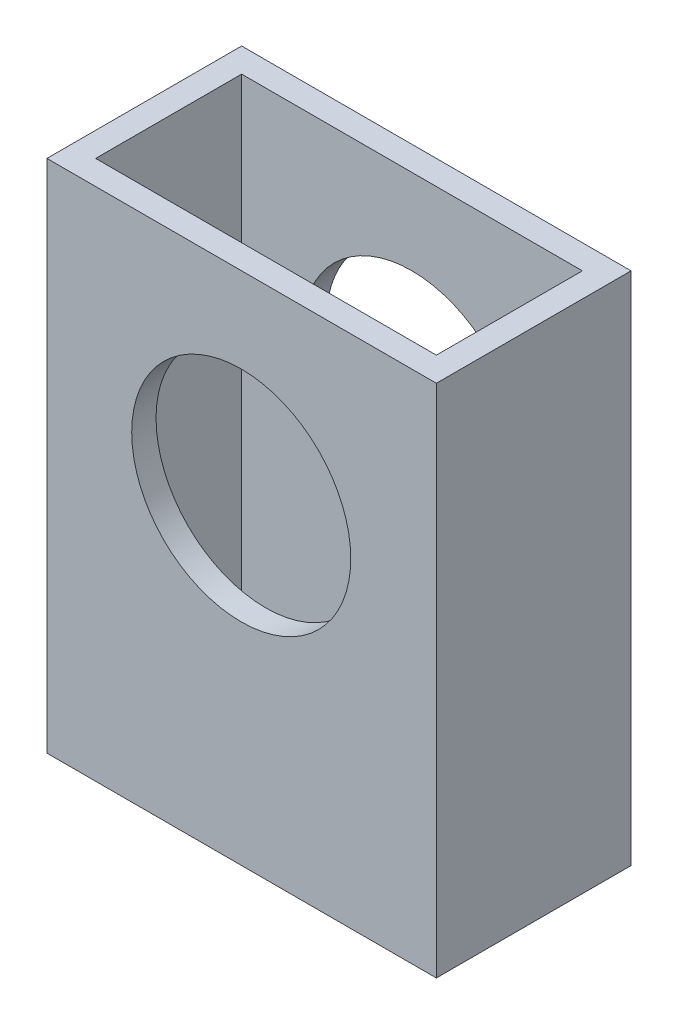
ISO-10303-21;
HEADER;
FILE_DESCRIPTION(('STEP AP214'),'2;1');
FILE_NAME('part.step','',(''),(''),'','','');
FILE_SCHEMA(('AUTOMOTIVE_DESIGN { 1 0 10303 214 1 1 1 1 }'));
ENDSEC;
DATA;
#1=APPLICATION_CONTEXT('core data for automotive mechanical design processes');
#2=APPLICATION_PROTOCOL_DEFINITION('international standard','automotive_design',2000,#1);
#3=PRODUCT_CONTEXT('',#1,'mechanical');
#4=PRODUCT('Part','Part','',(#3));
#5=PRODUCT_RELATED_PRODUCT_CATEGORY('part','',(#4));
#6=PRODUCT_DEFINITION_FORMATION('','',#4);
#7=PRODUCT_DEFINITION_CONTEXT('part definition',#1,'design');
#8=PRODUCT_DEFINITION('design','',#6,#7);
#9=PRODUCT_DEFINITION_SHAPE('','',#8);
#10=(LENGTH_UNIT() NAMED_UNIT(*) SI_UNIT(.MILLI.,.METRE.));
#11=(NAMED_UNIT(*) PLANE_ANGLE_UNIT() SI_UNIT($,.RADIAN.));
#12=(NAMED_UNIT(*) SI_UNIT($,.STERADIAN.) SOLID_ANGLE_UNIT());
#13=UNCERTAINTY_MEASURE_WITH_UNIT(LENGTH_MEASURE(1.E-05),#10,'distance_accuracy_value','');
#14=(GEOMETRIC_REPRESENTATION_CONTEXT(3) GLOBAL_UNCERTAINTY_ASSIGNED_CONTEXT((#13)) GLOBAL_UNIT_ASSIGNED_CONTEXT((#10,
#11,#12)) REPRESENTATION_CONTEXT('',''));
#15=CARTESIAN_POINT('',(0.,0.,0.));
#16=DIRECTION('',(0.,0.,1.));
#17=DIRECTION('',(1.,0.,0.));
#18=AXIS2_PLACEMENT_3D('',#15,#16,#17);
#19=CARTESIAN_POINT('',(-965.375181630745,609.549730060437,25.4));
#20=DIRECTION('',(0.,0.,-1.));
#21=DIRECTION('',(-1.,0.,0.));
#22=AXIS2_PLACEMENT_3D('',#19,#20,#21);
#23=CYLINDRICAL_SURFACE('',#22,14.2875000000222);
#24=CARTESIAN_POINT('',(-965.375181630745,609.549730060437,3.175));
#25=DIRECTION('',(0.,0.,-1.));
#26=DIRECTION('',(-1.,0.,0.));
#27=AXIS2_PLACEMENT_3D('',#24,#25,#26);
#28=CIRCLE('',#27,14.2875000000222);
#29=CARTESIAN_POINT('',(-979.662681630768,609.549730060437,3.175));
#30=VERTEX_POINT('',#29);
#31=EDGE_CURVE('E137',#30,#30,#28,.T.);
#32=ORIENTED_EDGE('',*,*,#31,.F.);
#33=EDGE_LOOP('',(#32));
#34=FACE_BOUND('',#33,.T.);
#35=CARTESIAN_POINT('',(-965.375181630745,609.549730060437,0.));
#36=DIRECTION('',(0.,0.,1.));
#37=DIRECTION('',(1.,0.,0.));
#38=AXIS2_PLACEMENT_3D('',#35,#36,#37);
#39=CIRCLE('',#38,14.2875000000222);
#40=CARTESIAN_POINT('',(-951.087681630723,609.549730060437,0.));
#41=VERTEX_POINT('',#40);
#42=EDGE_CURVE('E140',#41,#41,#39,.T.);
#43=ORIENTED_EDGE('',*,*,#42,.F.);
#44=EDGE_LOOP('',(#43));
#45=FACE_BOUND('',#44,.T.);
#46=ADVANCED_FACE('F33',(#34,#45),#23,.F.);
#47=CARTESIAN_POINT('',(-990.720655188937,0.,25.4));
#48=DIRECTION('',(1.,0.,0.));
#49=DIRECTION('',(0.,0.,-1.));
#50=AXIS2_PLACEMENT_3D('',#47,#48,#49);
#51=PLANE('',#50);
#52=DIRECTION('',(0.,-1.,0.));
#53=VECTOR('',#52,1.);
#54=CARTESIAN_POINT('',(-990.720655188937,0.,0.));
#55=LINE('',#54,#53);
#56=CARTESIAN_POINT('',(-990.720655188937,634.949730060437,0.));
#57=VERTEX_POINT('',#56);
#58=CARTESIAN_POINT('',(-990.720655188937,567.757532007204,0.));
#59=VERTEX_POINT('',#58);
#60=EDGE_CURVE('E159',#57,#59,#55,.T.);
#61=ORIENTED_EDGE('',*,*,#60,.T.);
#62=DIRECTION('',(0.,0.,-1.));
#63=VECTOR('',#62,1.);
#64=CARTESIAN_POINT('',(-990.720655188937,567.757532007204,25.4));
#65=LINE('',#64,#63);
#66=CARTESIAN_POINT('',(-990.720655188937,567.757532007204,25.4));
#67=VERTEX_POINT('',#66);
#68=EDGE_CURVE('E11',#67,#59,#65,.T.);
#69=ORIENTED_EDGE('',*,*,#68,.F.);
#70=DIRECTION('',(0.,-1.,0.));
#71=VECTOR('',#70,1.);
#72=CARTESIAN_POINT('',(-990.720655188937,0.,25.4));
#73=LINE('',#72,#71);
#74=CARTESIAN_POINT('',(-990.720655188937,634.949730060437,25.4));
#75=VERTEX_POINT('',#74);
#76=EDGE_CURVE('E144',#75,#67,#73,.T.);
#77=ORIENTED_EDGE('',*,*,#76,.F.);
#78=DIRECTION('',(0.,0.,-1.));
#79=VECTOR('',#78,1.);
#80=CARTESIAN_POINT('',(-990.720655188937,634.949730060437,25.4));
#81=LINE('',#80,#79);
#82=EDGE_CURVE('E156',#75,#57,#81,.T.);
#83=ORIENTED_EDGE('',*,*,#82,.T.);
#84=EDGE_LOOP('',(#61,#69,#77,#83));
#85=FACE_BOUND('',#84,.T.);
#86=ADVANCED_FACE('F189',(#85),#51,.F.);
#87=CARTESIAN_POINT('',(0.,567.757532007204,25.4));
#88=DIRECTION('',(0.,1.,0.));
#89=DIRECTION('',(0.,0.,1.));
#90=AXIS2_PLACEMENT_3D('',#87,#88,#89);
#91=PLANE('',#90);
#92=DIRECTION('',(-1.,0.,0.));
#93=VECTOR('',#92,1.);
#94=CARTESIAN_POINT('',(-987.545655188937,567.757532007204,3.175));
#95=LINE('',#94,#93);
#96=CARTESIAN_POINT('',(-943.095655188937,567.757532007204,3.175));
#97=VERTEX_POINT('',#96);
#98=CARTESIAN_POINT('',(-987.545655188937,567.757532007204,3.175));
#99=VERTEX_POINT('',#98);
#100=EDGE_CURVE('E106',#97,#99,#95,.T.);
#101=ORIENTED_EDGE('',*,*,#100,.T.);
#102=DIRECTION('',(0.,0.,1.));
#103=VECTOR('',#102,1.);
#104=CARTESIAN_POINT('',(-987.545655188937,567.757532007204,22.225));
#105=LINE('',#104,#103);
#106=CARTESIAN_POINT('',(-987.545655188937,567.757532007204,22.225));
#107=VERTEX_POINT('',#106);
#108=EDGE_CURVE('E100',#99,#107,#105,.T.);
#109=ORIENTED_EDGE('',*,*,#108,.T.);
#110=DIRECTION('',(1.,0.,0.));
#111=VECTOR('',#110,1.);
#112=CARTESIAN_POINT('',(-987.545655188937,567.757532007204,22.225));
#113=LINE('',#112,#111);
#114=CARTESIAN_POINT('',(-943.095655188937,567.757532007204,22.225));
#115=VERTEX_POINT('',#114);
#116=EDGE_CURVE('E109',#107,#115,#113,.T.);
#117=ORIENTED_EDGE('',*,*,#116,.T.);
#118=DIRECTION('',(0.,0.,-1.));
#119=VECTOR('',#118,1.);
#120=CARTESIAN_POINT('',(-943.095655188937,567.757532007204,22.225));
#121=LINE('',#120,#119);
#122=EDGE_CURVE('E48',#115,#97,#121,.T.);
#123=ORIENTED_EDGE('',*,*,#122,.T.);
#124=EDGE_LOOP('',(#101,#109,#117,#123));
#125=FACE_BOUND('',#124,.T.);
#126=DIRECTION('',(1.,0.,0.));
#127=VECTOR('',#126,1.);
#128=CARTESIAN_POINT('',(0.,567.757532007204,0.));
#129=LINE('',#128,#127);
#130=CARTESIAN_POINT('',(-939.920655188937,567.757532007204,0.));
#131=VERTEX_POINT('',#130);
#132=EDGE_CURVE('E162',#59,#131,#129,.T.);
#133=ORIENTED_EDGE('',*,*,#132,.T.);
#134=DIRECTION('',(0.,0.,-1.));
#135=VECTOR('',#134,1.);
#136=CARTESIAN_POINT('',(-939.920655188937,567.757532007204,25.4));
#137=LINE('',#136,#135);
#138=CARTESIAN_POINT('',(-939.920655188937,567.757532007204,25.4));
#139=VERTEX_POINT('',#138);
#140=EDGE_CURVE('E41',#139,#131,#137,.T.);
#141=ORIENTED_EDGE('',*,*,#140,.F.);
#142=DIRECTION('',(1.,0.,0.));
#143=VECTOR('',#142,1.);
#144=CARTESIAN_POINT('',(0.,567.757532007204,25.4));
#145=LINE('',#144,#143);
#146=EDGE_CURVE('E148',#67,#139,#145,.T.);
#147=ORIENTED_EDGE('',*,*,#146,.F.);
#148=ORIENTED_EDGE('',*,*,#68,.T.);
#149=EDGE_LOOP('',(#133,#141,#147,#148));
#150=FACE_BOUND('',#149,.T.);
#151=ADVANCED_FACE('F113',(#125,#150),#91,.F.);
#152=CARTESIAN_POINT('',(-939.920655188937,0.,25.4));
#153=DIRECTION('',(1.,0.,0.));
#154=DIRECTION('',(0.,0.,-1.));
#155=AXIS2_PLACEMENT_3D('',#152,#153,#154);
#156=PLANE('',#155);
#157=DIRECTION('',(0.,-1.,0.));
#158=VECTOR('',#157,1.);
#159=CARTESIAN_POINT('',(-939.920655188937,0.,0.));
#160=LINE('',#159,#158);
#161=CARTESIAN_POINT('',(-939.920655188937,634.949730060437,0.));
#162=VERTEX_POINT('',#161);
#163=EDGE_CURVE('E165',#162,#131,#160,.T.);
#164=ORIENTED_EDGE('',*,*,#163,.F.);
#165=DIRECTION('',(0.,0.,-1.));
#166=VECTOR('',#165,1.);
#167=CARTESIAN_POINT('',(-939.920655188937,634.949730060437,25.4));
#168=LINE('',#167,#166);
#169=CARTESIAN_POINT('',(-939.920655188937,634.949730060437,25.4));
#170=VERTEX_POINT('',#169);
#171=EDGE_CURVE('E171',#170,#162,#168,.T.);
#172=ORIENTED_EDGE('',*,*,#171,.F.);
#173=DIRECTION('',(0.,-1.,0.));
#174=VECTOR('',#173,1.);
#175=CARTESIAN_POINT('',(-939.920655188937,0.,25.4));
#176=LINE('',#175,#174);
#177=EDGE_CURVE('E150',#170,#139,#176,.T.);
#178=ORIENTED_EDGE('',*,*,#177,.T.);
#179=ORIENTED_EDGE('',*,*,#140,.T.);
#180=EDGE_LOOP('',(#164,#172,#178,#179));
#181=FACE_BOUND('',#180,.T.);
#182=ADVANCED_FACE('F175',(#181),#156,.T.);
#183=CARTESIAN_POINT('',(-965.375181630745,609.549730060437,22.225));
#184=DIRECTION('',(0.,0.,1.));
#185=DIRECTION('',(1.,0.,0.));
#186=AXIS2_PLACEMENT_3D('',#183,#184,#185);
#187=CIRCLE('',#186,14.2875000000222);
#188=CARTESIAN_POINT('',(-951.087681630723,609.549730060437,22.225));
#189=VERTEX_POINT('',#188);
#190=EDGE_CURVE('E131',#189,#189,#187,.T.);
#191=ORIENTED_EDGE('',*,*,#190,.F.);
#192=EDGE_LOOP('',(#191));
#193=FACE_BOUND('',#192,.T.);
#194=CARTESIAN_POINT('',(-965.375181630745,609.549730060437,25.4));
#195=DIRECTION('',(0.,0.,1.));
#196=DIRECTION('',(1.,0.,0.));
#197=AXIS2_PLACEMENT_3D('',#194,#195,#196);
#198=CIRCLE('',#197,14.2875000000222);
#199=CARTESIAN_POINT('',(-951.087681630723,609.549730060437,25.4));
#200=VERTEX_POINT('',#199);
#201=EDGE_CURVE('E141',#200,#200,#198,.T.);
#202=ORIENTED_EDGE('',*,*,#201,.T.);
#203=EDGE_LOOP('',(#202));
#204=FACE_BOUND('',#203,.T.);
#205=ADVANCED_FACE('F35',(#193,#204),#23,.F.);
#206=CARTESIAN_POINT('',(0.,634.949730060437,25.4));
#207=DIRECTION('',(0.,1.,0.));
#208=DIRECTION('',(0.,0.,1.));
#209=AXIS2_PLACEMENT_3D('',#206,#207,#208);
#210=PLANE('',#209);
#211=DIRECTION('',(0.,0.,1.));
#212=VECTOR('',#211,1.);
#213=CARTESIAN_POINT('',(-987.545655188937,634.949730060437,22.225));
#214=LINE('',#213,#212);
#215=CARTESIAN_POINT('',(-987.545655188937,634.949730060437,3.175));
#216=VERTEX_POINT('',#215);
#217=CARTESIAN_POINT('',(-987.545655188937,634.949730060437,22.225));
#218=VERTEX_POINT('',#217);
#219=EDGE_CURVE('E56',#216,#218,#214,.T.);
#220=ORIENTED_EDGE('',*,*,#219,.F.);
#221=DIRECTION('',(-1.,0.,0.));
#222=VECTOR('',#221,1.);
#223=CARTESIAN_POINT('',(-987.545655188937,634.949730060437,3.175));
#224=LINE('',#223,#222);
#225=CARTESIAN_POINT('',(-943.095655188937,634.949730060437,3.175));
#226=VERTEX_POINT('',#225);
#227=EDGE_CURVE('E116',#226,#216,#224,.T.);
#228=ORIENTED_EDGE('',*,*,#227,.F.);
#229=DIRECTION('',(0.,0.,-1.));
#230=VECTOR('',#229,1.);
#231=CARTESIAN_POINT('',(-943.095655188937,634.949730060437,22.225));
#232=LINE('',#231,#230);
#233=CARTESIAN_POINT('',(-943.095655188937,634.949730060437,22.225));
#234=VERTEX_POINT('',#233);
#235=EDGE_CURVE('E119',#234,#226,#232,.T.);
#236=ORIENTED_EDGE('',*,*,#235,.F.);
#237=DIRECTION('',(1.,0.,0.));
#238=VECTOR('',#237,1.);
#239=CARTESIAN_POINT('',(-987.545655188937,634.949730060437,22.225));
#240=LINE('',#239,#238);
#241=EDGE_CURVE('E125',#218,#234,#240,.T.);
#242=ORIENTED_EDGE('',*,*,#241,.F.);
#243=EDGE_LOOP('',(#220,#228,#236,#242));
#244=FACE_BOUND('',#243,.T.);
#245=DIRECTION('',(1.,0.,0.));
#246=VECTOR('',#245,1.);
#247=CARTESIAN_POINT('',(0.,634.949730060437,0.));
#248=LINE('',#247,#246);
#249=EDGE_CURVE('E145',#57,#162,#248,.T.);
#250=ORIENTED_EDGE('',*,*,#249,.F.);
#251=ORIENTED_EDGE('',*,*,#82,.F.);
#252=DIRECTION('',(1.,0.,0.));
#253=VECTOR('',#252,1.);
#254=CARTESIAN_POINT('',(0.,634.949730060437,25.4));
#255=LINE('',#254,#253);
#256=EDGE_CURVE('E153',#75,#170,#255,.T.);
#257=ORIENTED_EDGE('',*,*,#256,.T.);
#258=ORIENTED_EDGE('',*,*,#171,.T.);
#259=EDGE_LOOP('',(#250,#251,#257,#258));
#260=FACE_BOUND('',#259,.T.);
#261=ADVANCED_FACE('F183',(#244,#260),#210,.T.);
#262=CARTESIAN_POINT('',(0.,0.,25.4));
#263=DIRECTION('',(0.,0.,1.));
#264=DIRECTION('',(1.,0.,0.));
#265=AXIS2_PLACEMENT_3D('',#262,#263,#264);
#266=PLANE('',#265);
#267=ORIENTED_EDGE('',*,*,#201,.F.);
#268=EDGE_LOOP('',(#267));
#269=FACE_BOUND('',#268,.T.);
#270=ORIENTED_EDGE('',*,*,#76,.T.);
#271=ORIENTED_EDGE('',*,*,#146,.T.);
#272=ORIENTED_EDGE('',*,*,#177,.F.);
#273=ORIENTED_EDGE('',*,*,#256,.F.);
#274=EDGE_LOOP('',(#270,#271,#272,#273));
#275=FACE_BOUND('',#274,.T.);
#276=ADVANCED_FACE('F187',(#269,#275),#266,.T.);
#277=CARTESIAN_POINT('',(0.,0.,0.));
#278=DIRECTION('',(0.,0.,1.));
#279=DIRECTION('',(1.,0.,0.));
#280=AXIS2_PLACEMENT_3D('',#277,#278,#279);
#281=PLANE('',#280);
#282=ORIENTED_EDGE('',*,*,#42,.T.);
#283=EDGE_LOOP('',(#282));
#284=FACE_BOUND('',#283,.T.);
#285=ORIENTED_EDGE('',*,*,#60,.F.);
#286=ORIENTED_EDGE('',*,*,#249,.T.);
#287=ORIENTED_EDGE('',*,*,#163,.T.);
#288=ORIENTED_EDGE('',*,*,#132,.F.);
#289=EDGE_LOOP('',(#285,#286,#287,#288));
#290=FACE_BOUND('',#289,.T.);
#291=ADVANCED_FACE('F180',(#284,#290),#281,.F.);
#292=CARTESIAN_POINT('',(-987.545655188937,567.757532007204,22.225));
#293=DIRECTION('',(-1.,0.,0.));
#294=DIRECTION('',(0.,0.,1.));
#295=AXIS2_PLACEMENT_3D('',#292,#293,#294);
#296=PLANE('',#295);
#297=ORIENTED_EDGE('',*,*,#219,.T.);
#298=DIRECTION('',(0.,1.,0.));
#299=VECTOR('',#298,1.);
#300=CARTESIAN_POINT('',(-987.545655188937,567.757532007204,22.225));
#301=LINE('',#300,#299);
#302=EDGE_CURVE('E96',#107,#218,#301,.T.);
#303=ORIENTED_EDGE('',*,*,#302,.F.);
#304=ORIENTED_EDGE('',*,*,#108,.F.);
#305=DIRECTION('',(0.,1.,0.));
#306=VECTOR('',#305,1.);
#307=CARTESIAN_POINT('',(-987.545655188937,567.757532007204,3.175));
#308=LINE('',#307,#306);
#309=EDGE_CURVE('E129',#99,#216,#308,.T.);
#310=ORIENTED_EDGE('',*,*,#309,.T.);
#311=EDGE_LOOP('',(#297,#303,#304,#310));
#312=FACE_BOUND('',#311,.T.);
#313=ADVANCED_FACE('F98',(#312),#296,.F.);
#314=CARTESIAN_POINT('',(-987.545655188937,567.757532007204,3.175));
#315=DIRECTION('',(0.,0.,-1.));
#316=DIRECTION('',(-1.,0.,0.));
#317=AXIS2_PLACEMENT_3D('',#314,#315,#316);
#318=PLANE('',#317);
#319=ORIENTED_EDGE('',*,*,#31,.T.);
#320=EDGE_LOOP('',(#319));
#321=FACE_BOUND('',#320,.T.);
#322=ORIENTED_EDGE('',*,*,#227,.T.);
#323=ORIENTED_EDGE('',*,*,#309,.F.);
#324=ORIENTED_EDGE('',*,*,#100,.F.);
#325=DIRECTION('',(0.,1.,0.));
#326=VECTOR('',#325,1.);
#327=CARTESIAN_POINT('',(-943.095655188937,567.757532007204,3.175));
#328=LINE('',#327,#326);
#329=EDGE_CURVE('E132',#97,#226,#328,.T.);
#330=ORIENTED_EDGE('',*,*,#329,.T.);
#331=EDGE_LOOP('',(#322,#323,#324,#330));
#332=FACE_BOUND('',#331,.T.);
#333=ADVANCED_FACE('F211',(#321,#332),#318,.F.);
#334=CARTESIAN_POINT('',(-943.095655188937,567.757532007204,22.225));
#335=DIRECTION('',(1.,0.,0.));
#336=DIRECTION('',(0.,0.,-1.));
#337=AXIS2_PLACEMENT_3D('',#334,#335,#336);
#338=PLANE('',#337);
#339=ORIENTED_EDGE('',*,*,#235,.T.);
#340=ORIENTED_EDGE('',*,*,#329,.F.);
#341=ORIENTED_EDGE('',*,*,#122,.F.);
#342=DIRECTION('',(0.,1.,0.));
#343=VECTOR('',#342,1.);
#344=CARTESIAN_POINT('',(-943.095655188937,567.757532007204,22.225));
#345=LINE('',#344,#343);
#346=EDGE_CURVE('E105',#115,#234,#345,.T.);
#347=ORIENTED_EDGE('',*,*,#346,.T.);
#348=EDGE_LOOP('',(#339,#340,#341,#347));
#349=FACE_BOUND('',#348,.T.);
#350=ADVANCED_FACE('F214',(#349),#338,.F.);
#351=CARTESIAN_POINT('',(-987.545655188937,567.757532007204,22.225));
#352=DIRECTION('',(0.,0.,1.));
#353=DIRECTION('',(1.,0.,0.));
#354=AXIS2_PLACEMENT_3D('',#351,#352,#353);
#355=PLANE('',#354);
#356=ORIENTED_EDGE('',*,*,#190,.T.);
#357=EDGE_LOOP('',(#356));
#358=FACE_BOUND('',#357,.T.);
#359=ORIENTED_EDGE('',*,*,#241,.T.);
#360=ORIENTED_EDGE('',*,*,#346,.F.);
#361=ORIENTED_EDGE('',*,*,#116,.F.);
#362=ORIENTED_EDGE('',*,*,#302,.T.);
#363=EDGE_LOOP('',(#359,#360,#361,#362));
#364=FACE_BOUND('',#363,.T.);
#365=ADVANCED_FACE('F110',(#358,#364),#355,.F.);
#366=CLOSED_SHELL('',(#46,#86,#151,#182,#205,#261,#276,#291,#313,#333,#350,#365));
#367=MANIFOLD_SOLID_BREP('B2',#366);
#368=ADVANCED_BREP_SHAPE_REPRESENTATION('',(#18,#367),#14);
#369=SHAPE_DEFINITION_REPRESENTATION(#9,#368);
ENDSEC;
END-ISO-10303-21;
